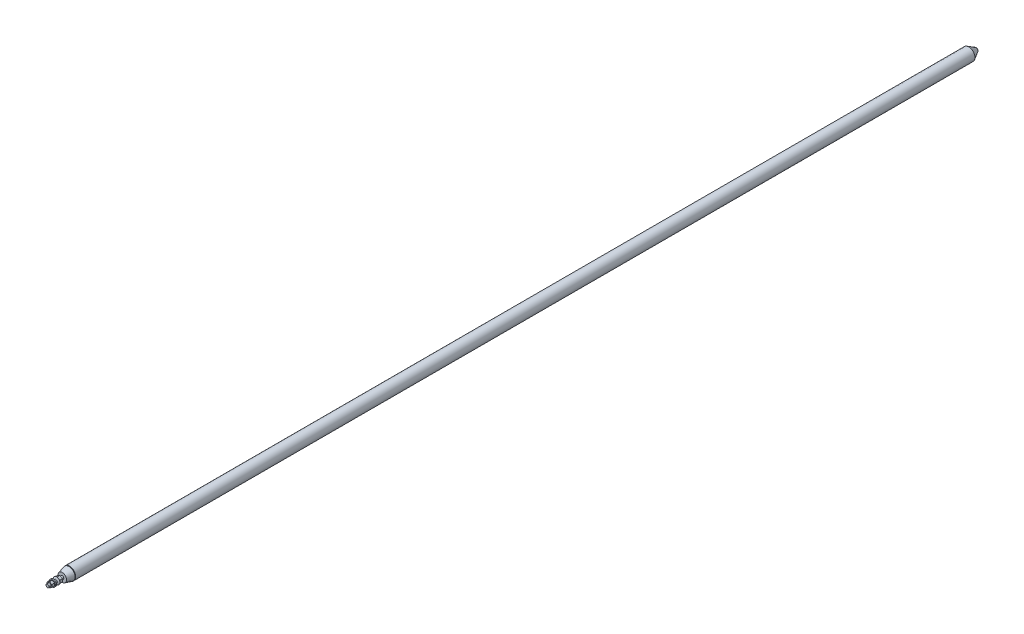
ISO-10303-21;
HEADER;
FILE_DESCRIPTION(('STEP AP214'),'2;1');
FILE_NAME('part.step','',(''),(''),'','','');
FILE_SCHEMA(('AUTOMOTIVE_DESIGN { 1 0 10303 214 1 1 1 1 }'));
ENDSEC;
DATA;
#1=APPLICATION_CONTEXT('core data for automotive mechanical design processes');
#2=APPLICATION_PROTOCOL_DEFINITION('international standard','automotive_design',2000,#1);
#3=PRODUCT_CONTEXT('',#1,'mechanical');
#4=PRODUCT('Part','Part','',(#3));
#5=PRODUCT_RELATED_PRODUCT_CATEGORY('part','',(#4));
#6=PRODUCT_DEFINITION_FORMATION('','',#4);
#7=PRODUCT_DEFINITION_CONTEXT('part definition',#1,'design');
#8=PRODUCT_DEFINITION('design','',#6,#7);
#9=PRODUCT_DEFINITION_SHAPE('','',#8);
#10=(LENGTH_UNIT() NAMED_UNIT(*) SI_UNIT(.MILLI.,.METRE.));
#11=(NAMED_UNIT(*) PLANE_ANGLE_UNIT() SI_UNIT($,.RADIAN.));
#12=(NAMED_UNIT(*) SI_UNIT($,.STERADIAN.) SOLID_ANGLE_UNIT());
#13=UNCERTAINTY_MEASURE_WITH_UNIT(LENGTH_MEASURE(1.E-05),#10,'distance_accuracy_value','');
#14=(GEOMETRIC_REPRESENTATION_CONTEXT(3) GLOBAL_UNCERTAINTY_ASSIGNED_CONTEXT((#13)) GLOBAL_UNIT_ASSIGNED_CONTEXT((#10,
#11,#12)) REPRESENTATION_CONTEXT('',''));
#15=CARTESIAN_POINT('',(0.,0.,0.));
#16=DIRECTION('',(0.,0.,1.));
#17=DIRECTION('',(1.,0.,0.));
#18=AXIS2_PLACEMENT_3D('',#15,#16,#17);
#19=CARTESIAN_POINT('',(0.,16.6751,52.1089983991226));
#20=DIRECTION('',(0.,0.,1.));
#21=DIRECTION('',(1.,0.,0.));
#22=AXIS2_PLACEMENT_3D('',#19,#20,#21);
#23=PLANE('',#22);
#24=CARTESIAN_POINT('',(0.,0.,52.1089983991226));
#25=DIRECTION('',(0.,0.,-1.));
#26=DIRECTION('',(-1.,0.,0.));
#27=AXIS2_PLACEMENT_3D('',#24,#25,#26);
#28=CIRCLE('',#27,16.6751);
#29=CARTESIAN_POINT('',(-16.6751,0.,52.1089983991226));
#30=VERTEX_POINT('',#29);
#31=EDGE_CURVE('E149',#30,#30,#28,.T.);
#32=ORIENTED_EDGE('',*,*,#31,.F.);
#33=EDGE_LOOP('',(#32));
#34=FACE_BOUND('',#33,.T.);
#35=DIRECTION('',(0.866025403784438,0.5,0.));
#36=VECTOR('',#35,1.);
#37=CARTESIAN_POINT('',(0.,-13.7554856334967,52.1089983991226));
#38=LINE('',#37,#36);
#39=CARTESIAN_POINT('',(0.,-13.7554856334967,52.1089983991226));
#40=VERTEX_POINT('',#39);
#41=CARTESIAN_POINT('',(11.9126,-6.87774281674833,52.1089983991226));
#42=VERTEX_POINT('',#41);
#43=EDGE_CURVE('E626',#40,#42,#38,.T.);
#44=ORIENTED_EDGE('',*,*,#43,.F.);
#45=DIRECTION('',(0.866025403784439,-0.499999999999999,0.));
#46=VECTOR('',#45,1.);
#47=CARTESIAN_POINT('',(-11.9126,-6.87774281674834,52.1089983991226));
#48=LINE('',#47,#46);
#49=CARTESIAN_POINT('',(-11.9126,-6.87774281674834,52.1089983991226));
#50=VERTEX_POINT('',#49);
#51=EDGE_CURVE('E147',#50,#40,#48,.T.);
#52=ORIENTED_EDGE('',*,*,#51,.F.);
#53=DIRECTION('',(0.,-1.,0.));
#54=VECTOR('',#53,1.);
#55=CARTESIAN_POINT('',(-11.9126,6.87774281674833,52.1089983991226));
#56=LINE('',#55,#54);
#57=CARTESIAN_POINT('',(-11.9126,6.87774281674833,52.1089983991226));
#58=VERTEX_POINT('',#57);
#59=EDGE_CURVE('E143',#58,#50,#56,.T.);
#60=ORIENTED_EDGE('',*,*,#59,.F.);
#61=DIRECTION('',(-0.866025403784439,-0.5,0.));
#62=VECTOR('',#61,1.);
#63=CARTESIAN_POINT('',(0.,13.7554856334967,52.1089983991226));
#64=LINE('',#63,#62);
#65=CARTESIAN_POINT('',(0.,13.7554856334967,52.1089983991226));
#66=VERTEX_POINT('',#65);
#67=EDGE_CURVE('E622',#66,#58,#64,.T.);
#68=ORIENTED_EDGE('',*,*,#67,.F.);
#69=DIRECTION('',(-0.866025403784439,0.5,0.));
#70=VECTOR('',#69,1.);
#71=CARTESIAN_POINT('',(11.9126,6.87774281674833,52.1089983991226));
#72=LINE('',#71,#70);
#73=CARTESIAN_POINT('',(11.9126,6.87774281674833,52.1089983991226));
#74=VERTEX_POINT('',#73);
#75=EDGE_CURVE('E634',#74,#66,#72,.T.);
#76=ORIENTED_EDGE('',*,*,#75,.F.);
#77=DIRECTION('',(0.,1.,0.));
#78=VECTOR('',#77,1.);
#79=CARTESIAN_POINT('',(11.9126,-6.87774281674833,52.1089983991226));
#80=LINE('',#79,#78);
#81=EDGE_CURVE('E628',#42,#74,#80,.T.);
#82=ORIENTED_EDGE('',*,*,#81,.F.);
#83=EDGE_LOOP('',(#44,#52,#60,#68,#76,#82));
#84=FACE_BOUND('',#83,.T.);
#85=ADVANCED_FACE('F33',(#34,#84),#23,.T.);
#86=CARTESIAN_POINT('',(0.,0.,0.));
#87=DIRECTION('',(0.,0.,-1.));
#88=DIRECTION('',(-1.,0.,0.));
#89=AXIS2_PLACEMENT_3D('',#86,#87,#88);
#90=CYLINDRICAL_SURFACE('',#89,7.93749999999999);
#91=CARTESIAN_POINT('',(0.,0.,46.2923983991226));
#92=DIRECTION('',(0.,0.,-1.));
#93=DIRECTION('',(-1.,0.,0.));
#94=AXIS2_PLACEMENT_3D('',#91,#92,#93);
#95=CIRCLE('',#94,7.93749999999999);
#96=CARTESIAN_POINT('',(-7.93749999999999,0.,46.2923983991226));
#97=VERTEX_POINT('',#96);
#98=EDGE_CURVE('E42',#97,#97,#95,.F.);
#99=ORIENTED_EDGE('',*,*,#98,.F.);
#100=EDGE_LOOP('',(#99));
#101=FACE_BOUND('',#100,.T.);
#102=CARTESIAN_POINT('',(0.,0.,33.5923983991226));
#103=DIRECTION('',(0.,0.,-1.));
#104=DIRECTION('',(-1.,0.,0.));
#105=AXIS2_PLACEMENT_3D('',#102,#103,#104);
#106=CIRCLE('',#105,7.93749999999999);
#107=CARTESIAN_POINT('',(0.,7.93749999999996,33.5923983991227));
#108=VERTEX_POINT('',#107);
#109=EDGE_CURVE('E236',#108,#108,#106,.T.);
#110=ORIENTED_EDGE('',*,*,#109,.F.);
#111=EDGE_LOOP('',(#110));
#112=FACE_BOUND('',#111,.T.);
#113=ADVANCED_FACE('F248',(#101,#112),#90,.T.);
#114=CARTESIAN_POINT('',(0.,0.,0.));
#115=DIRECTION('',(0.,0.,-1.));
#116=DIRECTION('',(-1.,0.,0.));
#117=AXIS2_PLACEMENT_3D('',#114,#115,#116);
#118=CIRCLE('',#117,7.93749999999999);
#119=CARTESIAN_POINT('',(-7.93749999999999,0.,0.));
#120=VERTEX_POINT('',#119);
#121=EDGE_CURVE('E224',#120,#120,#118,.T.);
#122=ORIENTED_EDGE('',*,*,#121,.F.);
#123=EDGE_LOOP('',(#122));
#124=FACE_BOUND('',#123,.T.);
#125=CARTESIAN_POINT('',(0.,0.,12.690475));
#126=DIRECTION('',(0.,0.,1.));
#127=DIRECTION('',(1.,0.,0.));
#128=AXIS2_PLACEMENT_3D('',#125,#126,#127);
#129=CIRCLE('',#128,7.93749999999999);
#130=CARTESIAN_POINT('',(7.93749999999999,0.,12.690475));
#131=VERTEX_POINT('',#130);
#132=EDGE_CURVE('E201',#131,#131,#129,.F.);
#133=ORIENTED_EDGE('',*,*,#132,.T.);
#134=EDGE_LOOP('',(#133));
#135=FACE_BOUND('',#134,.T.);
#136=ADVANCED_FACE('F251',(#124,#135),#90,.T.);
#137=CARTESIAN_POINT('',(0.,0.,-38.1));
#138=DIRECTION('',(0.,0.,1.));
#139=DIRECTION('',(1.,0.,0.));
#140=AXIS2_PLACEMENT_3D('',#137,#138,#139);
#141=CONICAL_SURFACE('',#140,28.575,0.780728808749583);
#142=CARTESIAN_POINT('',(0.,0.,-34.8952102827305));
#143=DIRECTION('',(0.,0.,-1.));
#144=DIRECTION('',(-1.,0.,0.));
#145=AXIS2_PLACEMENT_3D('',#142,#143,#144);
#146=CIRCLE('',#145,31.75);
#147=CARTESIAN_POINT('',(-31.75,0.,-34.8952102827305));
#148=VERTEX_POINT('',#147);
#149=EDGE_CURVE('E230',#148,#148,#146,.T.);
#150=ORIENTED_EDGE('',*,*,#149,.T.);
#151=EDGE_LOOP('',(#150));
#152=FACE_BOUND('',#151,.T.);
#153=CARTESIAN_POINT('',(0.,0.,-38.1));
#154=DIRECTION('',(0.,0.,-1.));
#155=DIRECTION('',(-1.,0.,0.));
#156=AXIS2_PLACEMENT_3D('',#153,#154,#155);
#157=CIRCLE('',#156,28.575);
#158=CARTESIAN_POINT('',(-28.575,0.,-38.1));
#159=VERTEX_POINT('',#158);
#160=EDGE_CURVE('E233',#159,#159,#157,.T.);
#161=ORIENTED_EDGE('',*,*,#160,.F.);
#162=EDGE_LOOP('',(#161));
#163=FACE_BOUND('',#162,.T.);
#164=ADVANCED_FACE('F454',(#152,#163),#141,.T.);
#165=CARTESIAN_POINT('',(0.,0.,-34.8952102827305));
#166=DIRECTION('',(0.,0.,-1.));
#167=DIRECTION('',(-1.,0.,0.));
#168=AXIS2_PLACEMENT_3D('',#165,#166,#167);
#169=CONICAL_SURFACE('',#168,31.75,0.266468742447018);
#170=CARTESIAN_POINT('',(0.,0.,0.));
#171=DIRECTION('',(0.,0.,-1.));
#172=DIRECTION('',(-1.,0.,0.));
#173=AXIS2_PLACEMENT_3D('',#170,#171,#172);
#174=CIRCLE('',#173,22.225);
#175=CARTESIAN_POINT('',(-22.225,0.,0.));
#176=VERTEX_POINT('',#175);
#177=EDGE_CURVE('E227',#176,#176,#174,.T.);
#178=ORIENTED_EDGE('',*,*,#177,.T.);
#179=EDGE_LOOP('',(#178));
#180=FACE_BOUND('',#179,.T.);
#181=ORIENTED_EDGE('',*,*,#149,.F.);
#182=EDGE_LOOP('',(#181));
#183=FACE_BOUND('',#182,.T.);
#184=ADVANCED_FACE('F540',(#180,#183),#169,.T.);
#185=CARTESIAN_POINT('',(0.,7.93749999999999,0.));
#186=DIRECTION('',(0.,0.,1.));
#187=DIRECTION('',(1.,0.,0.));
#188=AXIS2_PLACEMENT_3D('',#185,#186,#187);
#189=PLANE('',#188);
#190=ORIENTED_EDGE('',*,*,#121,.T.);
#191=EDGE_LOOP('',(#190));
#192=FACE_BOUND('',#191,.T.);
#193=ORIENTED_EDGE('',*,*,#177,.F.);
#194=EDGE_LOOP('',(#193));
#195=FACE_BOUND('',#194,.T.);
#196=ADVANCED_FACE('F527',(#192,#195),#189,.T.);
#197=CARTESIAN_POINT('',(0.,31.75,-38.1));
#198=DIRECTION('',(0.,0.,-1.));
#199=DIRECTION('',(-1.,0.,0.));
#200=AXIS2_PLACEMENT_3D('',#197,#198,#199);
#201=PLANE('',#200);
#202=ORIENTED_EDGE('',*,*,#160,.T.);
#203=EDGE_LOOP('',(#202));
#204=FACE_BOUND('',#203,.T.);
#205=CARTESIAN_POINT('',(0.,0.,-38.1));
#206=DIRECTION('',(0.,0.,1.));
#207=DIRECTION('',(1.,0.,0.));
#208=AXIS2_PLACEMENT_3D('',#205,#206,#207);
#209=CIRCLE('',#208,31.75);
#210=CARTESIAN_POINT('',(31.75,0.,-38.1));
#211=VERTEX_POINT('',#210);
#212=EDGE_CURVE('E205',#211,#211,#209,.T.);
#213=ORIENTED_EDGE('',*,*,#212,.T.);
#214=EDGE_LOOP('',(#213));
#215=FACE_BOUND('',#214,.T.);
#216=ADVANCED_FACE('F523',(#204,#215),#201,.F.);
#217=CARTESIAN_POINT('',(0.,0.,29.7434));
#218=DIRECTION('',(0.,0.,1.));
#219=DIRECTION('',(1.,0.,0.));
#220=AXIS2_PLACEMENT_3D('',#217,#218,#219);
#221=CYLINDRICAL_SURFACE('',#220,31.75);
#222=ORIENTED_EDGE('',*,*,#212,.F.);
#223=EDGE_LOOP('',(#222));
#224=FACE_BOUND('',#223,.T.);
#225=CARTESIAN_POINT('',(0.,0.,-4699.39623629016));
#226=DIRECTION('',(0.,0.,1.));
#227=DIRECTION('',(1.,0.,0.));
#228=AXIS2_PLACEMENT_3D('',#225,#226,#227);
#229=CIRCLE('',#228,31.75);
#230=CARTESIAN_POINT('',(31.75,0.,-4699.39623629016));
#231=VERTEX_POINT('',#230);
#232=EDGE_CURVE('E208',#231,#231,#229,.T.);
#233=ORIENTED_EDGE('',*,*,#232,.T.);
#234=EDGE_LOOP('',(#233));
#235=FACE_BOUND('',#234,.T.);
#236=ADVANCED_FACE('F526',(#224,#235),#221,.T.);
#237=CARTESIAN_POINT('',(0.,0.,-4735.33884943047));
#238=DIRECTION('',(0.,0.,1.));
#239=DIRECTION('',(1.,0.,0.));
#240=AXIS2_PLACEMENT_3D('',#237,#238,#239);
#241=CONICAL_SURFACE('',#240,10.9985226280628,0.523598775598275);
#242=ORIENTED_EDGE('',*,*,#232,.F.);
#243=EDGE_LOOP('',(#242));
#244=FACE_BOUND('',#243,.T.);
#245=CARTESIAN_POINT('',(0.,0.,-4735.33884943047));
#246=DIRECTION('',(0.,0.,1.));
#247=DIRECTION('',(1.,0.,0.));
#248=AXIS2_PLACEMENT_3D('',#245,#246,#247);
#249=CIRCLE('',#248,10.9985226280628);
#250=CARTESIAN_POINT('',(10.9985226280628,0.,-4735.33884943047));
#251=VERTEX_POINT('',#250);
#252=EDGE_CURVE('E211',#251,#251,#249,.T.);
#253=ORIENTED_EDGE('',*,*,#252,.T.);
#254=EDGE_LOOP('',(#253));
#255=FACE_BOUND('',#254,.T.);
#256=ADVANCED_FACE('F531',(#244,#255),#241,.T.);
#257=CARTESIAN_POINT('',(0.,0.,-4728.98884943047));
#258=DIRECTION('',(0.,0.,1.));
#259=DIRECTION('',(0.,1.,0.));
#260=AXIS2_PLACEMENT_3D('',#257,#258,#259);
#261=SPHERICAL_SURFACE('',#260,12.7000000000001);
#262=ORIENTED_EDGE('',*,*,#252,.F.);
#263=EDGE_LOOP('',(#262));
#264=FACE_BOUND('',#263,.T.);
#265=ADVANCED_FACE('F464',(#264),#261,.T.);
#266=CARTESIAN_POINT('',(13.5001,-7.79428636908687,12.690475));
#267=DIRECTION('',(-0.499999999999999,0.866025403784439,0.));
#268=DIRECTION('',(-0.866025403784439,-0.5,0.));
#269=AXIS2_PLACEMENT_3D('',#266,#267,#268);
#270=PLANE('',#269);
#271=DIRECTION('',(-0.866025403784439,-0.499999999999999,0.));
#272=VECTOR('',#271,1.);
#273=CARTESIAN_POINT('',(13.5001,-7.79428636908687,28.1686));
#274=LINE('',#273,#272);
#275=CARTESIAN_POINT('',(13.5001,-7.79428636908687,28.1686));
#276=VERTEX_POINT('',#275);
#277=CARTESIAN_POINT('',(0.,-15.5885727381737,28.1686));
#278=VERTEX_POINT('',#277);
#279=EDGE_CURVE('E160',#276,#278,#274,.T.);
#280=ORIENTED_EDGE('',*,*,#279,.T.);
#281=DIRECTION('',(0.,0.,1.));
#282=VECTOR('',#281,1.);
#283=CARTESIAN_POINT('',(0.,-15.5885727381737,12.690475));
#284=LINE('',#283,#282);
#285=CARTESIAN_POINT('',(0.,-15.5885727381737,12.690475));
#286=VERTEX_POINT('',#285);
#287=EDGE_CURVE('E199',#286,#278,#284,.T.);
#288=ORIENTED_EDGE('',*,*,#287,.F.);
#289=DIRECTION('',(-0.866025403784439,-0.499999999999999,0.));
#290=VECTOR('',#289,1.);
#291=CARTESIAN_POINT('',(13.5001,-7.79428636908687,12.690475));
#292=LINE('',#291,#290);
#293=CARTESIAN_POINT('',(13.5001,-7.79428636908687,12.690475));
#294=VERTEX_POINT('',#293);
#295=EDGE_CURVE('E161',#294,#286,#292,.T.);
#296=ORIENTED_EDGE('',*,*,#295,.F.);
#297=DIRECTION('',(0.,0.,1.));
#298=VECTOR('',#297,1.);
#299=CARTESIAN_POINT('',(13.5001,-7.79428636908687,12.690475));
#300=LINE('',#299,#298);
#301=EDGE_CURVE('E175',#294,#276,#300,.T.);
#302=ORIENTED_EDGE('',*,*,#301,.T.);
#303=EDGE_LOOP('',(#280,#288,#296,#302));
#304=FACE_BOUND('',#303,.T.);
#305=ADVANCED_FACE('F292',(#304),#270,.F.);
#306=CARTESIAN_POINT('',(0.,-15.5885727381737,12.690475));
#307=DIRECTION('',(0.5,0.866025403784438,0.));
#308=DIRECTION('',(-0.866025403784438,0.5,0.));
#309=AXIS2_PLACEMENT_3D('',#306,#307,#308);
#310=PLANE('',#309);
#311=DIRECTION('',(-0.866025403784438,0.5,0.));
#312=VECTOR('',#311,1.);
#313=CARTESIAN_POINT('',(0.,-15.5885727381737,28.1686));
#314=LINE('',#313,#312);
#315=CARTESIAN_POINT('',(-13.5001,-7.79428636908686,28.1686));
#316=VERTEX_POINT('',#315);
#317=EDGE_CURVE('E178',#278,#316,#314,.T.);
#318=ORIENTED_EDGE('',*,*,#317,.T.);
#319=DIRECTION('',(0.,0.,1.));
#320=VECTOR('',#319,1.);
#321=CARTESIAN_POINT('',(-13.5001,-7.79428636908686,12.690475));
#322=LINE('',#321,#320);
#323=CARTESIAN_POINT('',(-13.5001,-7.79428636908686,12.690475));
#324=VERTEX_POINT('',#323);
#325=EDGE_CURVE('E196',#324,#316,#322,.T.);
#326=ORIENTED_EDGE('',*,*,#325,.F.);
#327=DIRECTION('',(-0.866025403784438,0.5,0.));
#328=VECTOR('',#327,1.);
#329=CARTESIAN_POINT('',(0.,-15.5885727381737,12.690475));
#330=LINE('',#329,#328);
#331=EDGE_CURVE('E164',#286,#324,#330,.T.);
#332=ORIENTED_EDGE('',*,*,#331,.F.);
#333=ORIENTED_EDGE('',*,*,#287,.T.);
#334=EDGE_LOOP('',(#318,#326,#332,#333));
#335=FACE_BOUND('',#334,.T.);
#336=ADVANCED_FACE('F280',(#335),#310,.F.);
#337=CARTESIAN_POINT('',(-13.5001,-7.79428636908686,12.690475));
#338=DIRECTION('',(1.,0.,0.));
#339=DIRECTION('',(0.,1.,0.));
#340=AXIS2_PLACEMENT_3D('',#337,#338,#339);
#341=PLANE('',#340);
#342=DIRECTION('',(0.,1.,0.));
#343=VECTOR('',#342,1.);
#344=CARTESIAN_POINT('',(-13.5001,-7.79428636908686,28.1686));
#345=LINE('',#344,#343);
#346=CARTESIAN_POINT('',(-13.5001,7.79428636908686,28.1686));
#347=VERTEX_POINT('',#346);
#348=EDGE_CURVE('E180',#316,#347,#345,.T.);
#349=ORIENTED_EDGE('',*,*,#348,.T.);
#350=DIRECTION('',(0.,0.,1.));
#351=VECTOR('',#350,1.);
#352=CARTESIAN_POINT('',(-13.5001,7.79428636908686,12.690475));
#353=LINE('',#352,#351);
#354=CARTESIAN_POINT('',(-13.5001,7.79428636908686,12.690475));
#355=VERTEX_POINT('',#354);
#356=EDGE_CURVE('E193',#355,#347,#353,.T.);
#357=ORIENTED_EDGE('',*,*,#356,.F.);
#358=DIRECTION('',(0.,1.,0.));
#359=VECTOR('',#358,1.);
#360=CARTESIAN_POINT('',(-13.5001,-7.79428636908686,12.690475));
#361=LINE('',#360,#359);
#362=EDGE_CURVE('E167',#324,#355,#361,.T.);
#363=ORIENTED_EDGE('',*,*,#362,.F.);
#364=ORIENTED_EDGE('',*,*,#325,.T.);
#365=EDGE_LOOP('',(#349,#357,#363,#364));
#366=FACE_BOUND('',#365,.T.);
#367=ADVANCED_FACE('F284',(#366),#341,.F.);
#368=CARTESIAN_POINT('',(-13.5001,7.79428636908686,12.690475));
#369=DIRECTION('',(0.5,-0.866025403784439,0.));
#370=DIRECTION('',(0.866025403784439,0.5,0.));
#371=AXIS2_PLACEMENT_3D('',#368,#369,#370);
#372=PLANE('',#371);
#373=DIRECTION('',(0.866025403784439,0.5,0.));
#374=VECTOR('',#373,1.);
#375=CARTESIAN_POINT('',(-13.5001,7.79428636908686,28.1686));
#376=LINE('',#375,#374);
#377=CARTESIAN_POINT('',(0.,15.5885727381737,28.1686));
#378=VERTEX_POINT('',#377);
#379=EDGE_CURVE('E182',#347,#378,#376,.T.);
#380=ORIENTED_EDGE('',*,*,#379,.T.);
#381=DIRECTION('',(0.,0.,1.));
#382=VECTOR('',#381,1.);
#383=CARTESIAN_POINT('',(0.,15.5885727381737,12.690475));
#384=LINE('',#383,#382);
#385=CARTESIAN_POINT('',(0.,15.5885727381737,12.690475));
#386=VERTEX_POINT('',#385);
#387=EDGE_CURVE('E190',#386,#378,#384,.T.);
#388=ORIENTED_EDGE('',*,*,#387,.F.);
#389=DIRECTION('',(0.866025403784439,0.5,0.));
#390=VECTOR('',#389,1.);
#391=CARTESIAN_POINT('',(-13.5001,7.79428636908686,12.690475));
#392=LINE('',#391,#390);
#393=EDGE_CURVE('E169',#355,#386,#392,.T.);
#394=ORIENTED_EDGE('',*,*,#393,.F.);
#395=ORIENTED_EDGE('',*,*,#356,.T.);
#396=EDGE_LOOP('',(#380,#388,#394,#395));
#397=FACE_BOUND('',#396,.T.);
#398=ADVANCED_FACE('F299',(#397),#372,.F.);
#399=CARTESIAN_POINT('',(0.,15.5885727381737,12.690475));
#400=DIRECTION('',(-0.5,-0.866025403784438,0.));
#401=DIRECTION('',(0.866025403784439,-0.5,0.));
#402=AXIS2_PLACEMENT_3D('',#399,#400,#401);
#403=PLANE('',#402);
#404=DIRECTION('',(0.866025403784438,-0.5,0.));
#405=VECTOR('',#404,1.);
#406=CARTESIAN_POINT('',(0.,15.5885727381737,28.1686));
#407=LINE('',#406,#405);
#408=CARTESIAN_POINT('',(13.5001,7.79428636908686,28.1686));
#409=VERTEX_POINT('',#408);
#410=EDGE_CURVE('E184',#378,#409,#407,.T.);
#411=ORIENTED_EDGE('',*,*,#410,.T.);
#412=DIRECTION('',(0.,0.,1.));
#413=VECTOR('',#412,1.);
#414=CARTESIAN_POINT('',(13.5001,7.79428636908686,12.690475));
#415=LINE('',#414,#413);
#416=CARTESIAN_POINT('',(13.5001,7.79428636908686,12.690475));
#417=VERTEX_POINT('',#416);
#418=EDGE_CURVE('E57',#417,#409,#415,.T.);
#419=ORIENTED_EDGE('',*,*,#418,.F.);
#420=DIRECTION('',(0.866025403784438,-0.5,0.));
#421=VECTOR('',#420,1.);
#422=CARTESIAN_POINT('',(0.,15.5885727381737,12.690475));
#423=LINE('',#422,#421);
#424=EDGE_CURVE('E171',#386,#417,#423,.T.);
#425=ORIENTED_EDGE('',*,*,#424,.F.);
#426=ORIENTED_EDGE('',*,*,#387,.T.);
#427=EDGE_LOOP('',(#411,#419,#425,#426));
#428=FACE_BOUND('',#427,.T.);
#429=ADVANCED_FACE('F296',(#428),#403,.F.);
#430=CARTESIAN_POINT('',(13.5001,7.79428636908686,12.690475));
#431=DIRECTION('',(-1.,0.,0.));
#432=DIRECTION('',(0.,0.,1.));
#433=AXIS2_PLACEMENT_3D('',#430,#431,#432);
#434=PLANE('',#433);
#435=DIRECTION('',(0.,-1.,0.));
#436=VECTOR('',#435,1.);
#437=CARTESIAN_POINT('',(13.5001,7.79428636908686,28.1686));
#438=LINE('',#437,#436);
#439=EDGE_CURVE('E165',#409,#276,#438,.T.);
#440=ORIENTED_EDGE('',*,*,#439,.T.);
#441=ORIENTED_EDGE('',*,*,#301,.F.);
#442=DIRECTION('',(0.,-1.,0.));
#443=VECTOR('',#442,1.);
#444=CARTESIAN_POINT('',(13.5001,7.79428636908686,12.690475));
#445=LINE('',#444,#443);
#446=EDGE_CURVE('E173',#417,#294,#445,.T.);
#447=ORIENTED_EDGE('',*,*,#446,.F.);
#448=ORIENTED_EDGE('',*,*,#418,.T.);
#449=EDGE_LOOP('',(#440,#441,#447,#448));
#450=FACE_BOUND('',#449,.T.);
#451=ADVANCED_FACE('F293',(#450),#434,.F.);
#452=CARTESIAN_POINT('',(13.5001,-7.79428636908687,12.690475));
#453=DIRECTION('',(0.,0.,1.));
#454=DIRECTION('',(1.,0.,0.));
#455=AXIS2_PLACEMENT_3D('',#452,#453,#454);
#456=PLANE('',#455);
#457=ORIENTED_EDGE('',*,*,#132,.F.);
#458=EDGE_LOOP('',(#457));
#459=FACE_BOUND('',#458,.T.);
#460=ORIENTED_EDGE('',*,*,#295,.T.);
#461=ORIENTED_EDGE('',*,*,#331,.T.);
#462=ORIENTED_EDGE('',*,*,#362,.T.);
#463=ORIENTED_EDGE('',*,*,#393,.T.);
#464=ORIENTED_EDGE('',*,*,#424,.T.);
#465=ORIENTED_EDGE('',*,*,#446,.T.);
#466=EDGE_LOOP('',(#460,#461,#462,#463,#464,#465));
#467=FACE_BOUND('',#466,.T.);
#468=ADVANCED_FACE('F260',(#459,#467),#456,.F.);
#469=CARTESIAN_POINT('',(0.,0.,0.0435161764705885));
#470=DIRECTION('',(0.,0.,-1.));
#471=DIRECTION('',(0.,1.,0.));
#472=AXIS2_PLACEMENT_3D('',#469,#470,#471);
#473=SPHERICAL_SURFACE('',#472,34.4750838235294);
#474=CARTESIAN_POINT('',(0.,0.,29.7688));
#475=DIRECTION('',(0.,0.,-1.));
#476=DIRECTION('',(-1.,0.,0.));
#477=AXIS2_PLACEMENT_3D('',#474,#475,#476);
#478=CIRCLE('',#477,17.4625);
#479=CARTESIAN_POINT('',(0.,17.4625,29.7688));
#480=VERTEX_POINT('',#479);
#481=EDGE_CURVE('E215',#480,#480,#478,.T.);
#482=CARTESIAN_POINT('',(0.,7.93749999999996,33.5923983991227));
#483=CARTESIAN_POINT('',(0.,8.04193033230631,33.5676907138939));
#484=CARTESIAN_POINT('',(0.,8.14624529277318,33.5424953955937));
#485=CARTESIAN_POINT('',(0.,8.35463538983752,33.4911317569022));
#486=CARTESIAN_POINT('',(0.,8.458710526435,33.464963436511));
#487=CARTESIAN_POINT('',(0.,8.66661189557016,33.4116560576896));
#488=CARTESIAN_POINT('',(0.,8.77043812810784,33.3845169992594));
#489=CARTESIAN_POINT('',(0.,8.97783263624223,33.3292705157999));
#490=CARTESIAN_POINT('',(0.,9.08140091183892,33.3011630907704));
#491=CARTESIAN_POINT('',(0.,9.28827047420351,33.2439823239056));
#492=CARTESIAN_POINT('',(0.,9.39157176097139,33.2149089820701));
#493=CARTESIAN_POINT('',(0.,9.59789833747534,33.1557989172506));
#494=CARTESIAN_POINT('',(0.,9.7009236272114,33.1257621942665));
#495=CARTESIAN_POINT('',(0.,9.90668922540895,33.0647279863804));
#496=CARTESIAN_POINT('',(0.,10.0094295338704,33.0337305014784));
#497=CARTESIAN_POINT('',(0.,10.2146162101565,32.9707774728867));
#498=CARTESIAN_POINT('',(0.,10.3170625779811,32.938821929197));
#499=CARTESIAN_POINT('',(0.,10.521652439256,32.8739555696753));
#500=CARTESIAN_POINT('',(0.,10.6237959327063,32.8410447538433));
#501=CARTESIAN_POINT('',(0.,10.8277711379095,32.7742707199945));
#502=CARTESIAN_POINT('',(0.,10.9296028496623,32.7404075019776));
#503=CARTESIAN_POINT('',(0.,11.132945611335,32.6717316167674));
#504=CARTESIAN_POINT('',(0.,11.234456661255,32.636918949574));
#505=CARTESIAN_POINT('',(0.,11.4371492470899,32.5663472018157));
#506=CARTESIAN_POINT('',(0.,11.5383307830049,32.5305881212508));
#507=CARTESIAN_POINT('',(0.,11.7403555173927,32.458126665085));
#508=CARTESIAN_POINT('',(0.,11.8411987158655,32.4214242894841));
#509=CARTESIAN_POINT('',(0.,12.042537981436,32.3470794438415));
#510=CARTESIAN_POINT('',(0.,12.1430340485337,32.3094369737997));
#511=CARTESIAN_POINT('',(0.,12.3436702876927,32.2332152218499));
#512=CARTESIAN_POINT('',(0.,12.4438104597538,32.194635939942));
#513=CARTESIAN_POINT('',(0.,12.6437261762134,32.1165439285288));
#514=CARTESIAN_POINT('',(0.,12.7435017206118,32.0770311990235));
#515=CARTESIAN_POINT('',(0.,12.9426794809169,31.9970757380846));
#516=CARTESIAN_POINT('',(0.,13.0420816968236,31.956633006651));
#517=CARTESIAN_POINT('',(0.,13.2405041318717,31.8748210686243));
#518=CARTESIAN_POINT('',(0.,13.3395243510132,31.8334518620313));
#519=CARTESIAN_POINT('',(0.,13.5371741575694,31.7497905812473));
#520=CARTESIAN_POINT('',(0.,13.6358037449841,31.7074985070563));
#521=CARTESIAN_POINT('',(0.,13.8326636871895,31.6219951791153));
#522=CARTESIAN_POINT('',(0.,13.9308940419803,31.5787839253653));
#523=CARTESIAN_POINT('',(0.,14.1269469528556,31.4914460065018));
#524=CARTESIAN_POINT('',(0.,14.2247695089402,31.4473193413882));
#525=CARTESIAN_POINT('',(0.,14.4199982918825,31.3581544478201));
#526=CARTESIAN_POINT('',(0.,14.5174045187402,31.3131162193657));
#527=CARTESIAN_POINT('',(0.,14.7117921490136,31.2221321266308));
#528=CARTESIAN_POINT('',(0.,14.8087735524293,31.1761862623503));
#529=CARTESIAN_POINT('',(0.,15.0023030786502,31.0833909046278));
#530=CARTESIAN_POINT('',(0.,15.0988512014553,31.0365414111859));
#531=CARTESIAN_POINT('',(0.,15.2915057470694,30.9419428806036));
#532=CARTESIAN_POINT('',(0.,15.3876121698782,30.8941938434631));
#533=CARTESIAN_POINT('',(0.,15.579374934636,30.7978003893978));
#534=CARTESIAN_POINT('',(0.,15.675031276585,30.749155972473));
#535=CARTESIAN_POINT('',(0.,15.8658855379922,30.6509760008058));
#536=CARTESIAN_POINT('',(0.,15.9610834574505,30.6014404460634));
#537=CARTESIAN_POINT('',(0.,16.1510125722821,30.5014825185434));
#538=CARTESIAN_POINT('',(0.,16.2457437676554,30.4510601457658));
#539=CARTESIAN_POINT('',(0.,16.4347311731984,30.3493329789012));
#540=CARTESIAN_POINT('',(0.,16.5289873833681,30.2980281848143));
#541=CARTESIAN_POINT('',(0.,16.7170165996438,30.194540650465));
#542=CARTESIAN_POINT('',(0.,16.8107896057498,30.1423579102026));
#543=CARTESIAN_POINT('',(0.,16.9978442340481,30.0371190297578));
#544=CARTESIAN_POINT('',(0.,17.0911258562404,29.9840628895754));
#545=CARTESIAN_POINT('',(0.,17.2771895913833,29.877081852009));
#546=CARTESIAN_POINT('',(0.,17.369971704334,29.8231569546252));
#547=CARTESIAN_POINT('',(0.,17.4625,29.7688));
#548=B_SPLINE_CURVE_WITH_KNOTS('',3,(#482,#483,#484,#485,#486,#487,#488,#489,#490,#491,#492,
#493,#494,#495,#496,#497,#498,#499,#500,#501,#502,#503,#504,#505,#506,#507,#508,#509,#510,#511,
#512,#513,#514,#515,#516,#517,#518,#519,#520,#521,#522,#523,#524,#525,#526,#527,#528,#529,#530,
#531,#532,#533,#534,#535,#536,#537,#538,#539,#540,#541,#542,#543,#544,#545,#546,#547),
.UNSPECIFIED.,.F.,.F.,(4,2,2,2,2,2,2,2,2,2,2,2,2,2,2,2,2,2,2,2,2,2,2,2,2,2,2,2,2,2,2,2,4),(0.,
0.321939004572816,0.643878009145632,0.965817013718447,1.28775601829126,1.60969502286408,
1.9316340274369,2.25357303200971,2.57551203658253,2.89745104115534,3.21939004572815,
3.54132905030097,3.86326805487378,4.1852070594466,4.50714606401941,4.82908506859223,
5.15102407316505,5.47296307773786,5.79490208231068,6.11684108688349,6.43878009145631,
6.76071909602913,7.08265810060194,7.40459710517475,7.72653610974757,8.04847511432038,
8.3704141188932,8.69235312346602,9.01429212803883,9.33623113261165,9.65817013718446,
9.98010914175728,10.3020481463301),.UNSPECIFIED.);
#549=EDGE_CURVE('BSEAM256',#108,#480,#548,.T.);
#550=ORIENTED_EDGE('',*,*,#109,.T.);
#551=ORIENTED_EDGE('',*,*,#481,.F.);
#552=ORIENTED_EDGE('',*,*,#549,.T.);
#553=ORIENTED_EDGE('',*,*,#549,.F.);
#554=EDGE_LOOP('',(#550,#552,#551,#553));
#555=FACE_BOUND('',#554,.T.);
#556=ADVANCED_FACE('F256',(#555),#473,.T.);
#557=CARTESIAN_POINT('',(0.,0.,0.));
#558=DIRECTION('',(0.,0.,-1.));
#559=DIRECTION('',(-1.,0.,0.));
#560=AXIS2_PLACEMENT_3D('',#557,#558,#559);
#561=CYLINDRICAL_SURFACE('',#560,17.4625);
#562=ORIENTED_EDGE('',*,*,#481,.T.);
#563=EDGE_LOOP('',(#562));
#564=FACE_BOUND('',#563,.T.);
#565=CARTESIAN_POINT('',(0.,0.,28.1686));
#566=DIRECTION('',(0.,0.,-1.));
#567=DIRECTION('',(-1.,0.,0.));
#568=AXIS2_PLACEMENT_3D('',#565,#566,#567);
#569=CIRCLE('',#568,17.4625);
#570=CARTESIAN_POINT('',(-17.4625,0.,28.1686));
#571=VERTEX_POINT('',#570);
#572=EDGE_CURVE('E218',#571,#571,#569,.T.);
#573=ORIENTED_EDGE('',*,*,#572,.F.);
#574=EDGE_LOOP('',(#573));
#575=FACE_BOUND('',#574,.T.);
#576=ADVANCED_FACE('F259',(#564,#575),#561,.T.);
#577=CARTESIAN_POINT('',(0.,0.,28.1686));
#578=DIRECTION('',(0.,0.,-1.));
#579=DIRECTION('',(-1.,0.,0.));
#580=AXIS2_PLACEMENT_3D('',#577,#578,#579);
#581=PLANE('',#580);
#582=ORIENTED_EDGE('',*,*,#572,.T.);
#583=EDGE_LOOP('',(#582));
#584=FACE_BOUND('',#583,.T.);
#585=ORIENTED_EDGE('',*,*,#317,.F.);
#586=ORIENTED_EDGE('',*,*,#279,.F.);
#587=ORIENTED_EDGE('',*,*,#439,.F.);
#588=ORIENTED_EDGE('',*,*,#410,.F.);
#589=ORIENTED_EDGE('',*,*,#379,.F.);
#590=ORIENTED_EDGE('',*,*,#348,.F.);
#591=EDGE_LOOP('',(#585,#586,#587,#588,#589,#590));
#592=FACE_BOUND('',#591,.T.);
#593=ADVANCED_FACE('F266',(#584,#592),#581,.T.);
#594=CARTESIAN_POINT('',(0.,0.,46.2923983991226));
#595=DIRECTION('',(0.,0.,-1.));
#596=DIRECTION('',(-1.,0.,0.));
#597=AXIS2_PLACEMENT_3D('',#594,#595,#596);
#598=PLANE('',#597);
#599=ORIENTED_EDGE('',*,*,#98,.T.);
#600=EDGE_LOOP('',(#599));
#601=FACE_BOUND('',#600,.T.);
#602=CARTESIAN_POINT('',(0.,0.,46.2923983991226));
#603=DIRECTION('',(0.,0.,-1.));
#604=DIRECTION('',(-1.,0.,0.));
#605=AXIS2_PLACEMENT_3D('',#602,#603,#604);
#606=CIRCLE('',#605,16.6751);
#607=CARTESIAN_POINT('',(-16.6751,0.,46.2923983991226));
#608=VERTEX_POINT('',#607);
#609=EDGE_CURVE('E152',#608,#608,#606,.T.);
#610=ORIENTED_EDGE('',*,*,#609,.T.);
#611=EDGE_LOOP('',(#610));
#612=FACE_BOUND('',#611,.T.);
#613=ADVANCED_FACE('F245',(#601,#612),#598,.T.);
#614=CARTESIAN_POINT('',(0.,0.,0.));
#615=DIRECTION('',(0.,0.,-1.));
#616=DIRECTION('',(-1.,0.,0.));
#617=AXIS2_PLACEMENT_3D('',#614,#615,#616);
#618=CYLINDRICAL_SURFACE('',#617,16.6751);
#619=ORIENTED_EDGE('',*,*,#31,.T.);
#620=EDGE_LOOP('',(#619));
#621=FACE_BOUND('',#620,.T.);
#622=ORIENTED_EDGE('',*,*,#609,.F.);
#623=EDGE_LOOP('',(#622));
#624=FACE_BOUND('',#623,.T.);
#625=ADVANCED_FACE('F318',(#621,#624),#618,.T.);
#626=CARTESIAN_POINT('',(-11.9126,-6.87774281674834,65.9996233991226));
#627=DIRECTION('',(0.499999999999999,0.866025403784439,0.));
#628=DIRECTION('',(-0.866025403784439,0.499999999999999,0.));
#629=AXIS2_PLACEMENT_3D('',#626,#627,#628);
#630=PLANE('',#629);
#631=ORIENTED_EDGE('',*,*,#51,.T.);
#632=DIRECTION('',(0.,0.,-1.));
#633=VECTOR('',#632,1.);
#634=CARTESIAN_POINT('',(0.,-13.7554856334967,65.9996233991226));
#635=LINE('',#634,#633);
#636=CARTESIAN_POINT('',(0.,-13.7554856334967,65.9996233991226));
#637=VERTEX_POINT('',#636);
#638=EDGE_CURVE('E128',#637,#40,#635,.T.);
#639=ORIENTED_EDGE('',*,*,#638,.F.);
#640=DIRECTION('',(0.866025403784439,-0.499999999999999,0.));
#641=VECTOR('',#640,1.);
#642=CARTESIAN_POINT('',(-11.9126,-6.87774281674834,65.9996233991226));
#643=LINE('',#642,#641);
#644=CARTESIAN_POINT('',(-11.9126,-6.87774281674834,65.9996233991226));
#645=VERTEX_POINT('',#644);
#646=EDGE_CURVE('E135',#645,#637,#643,.T.);
#647=ORIENTED_EDGE('',*,*,#646,.F.);
#648=DIRECTION('',(0.,0.,-1.));
#649=VECTOR('',#648,1.);
#650=CARTESIAN_POINT('',(-11.9126,-6.87774281674834,65.9996233991226));
#651=LINE('',#650,#649);
#652=EDGE_CURVE('E620',#645,#50,#651,.T.);
#653=ORIENTED_EDGE('',*,*,#652,.T.);
#654=EDGE_LOOP('',(#631,#639,#647,#653));
#655=FACE_BOUND('',#654,.T.);
#656=ADVANCED_FACE('F145',(#655),#630,.F.);
#657=CARTESIAN_POINT('',(0.,-13.7554856334967,65.9996233991226));
#658=DIRECTION('',(-0.5,0.866025403784438,0.));
#659=DIRECTION('',(-0.866025403784438,-0.5,0.));
#660=AXIS2_PLACEMENT_3D('',#657,#658,#659);
#661=PLANE('',#660);
#662=ORIENTED_EDGE('',*,*,#43,.T.);
#663=DIRECTION('',(0.,0.,-1.));
#664=VECTOR('',#663,1.);
#665=CARTESIAN_POINT('',(11.9126,-6.87774281674833,65.9996233991226));
#666=LINE('',#665,#664);
#667=CARTESIAN_POINT('',(11.9126,-6.87774281674833,65.9996233991226));
#668=VERTEX_POINT('',#667);
#669=EDGE_CURVE('E131',#668,#42,#666,.T.);
#670=ORIENTED_EDGE('',*,*,#669,.F.);
#671=DIRECTION('',(0.866025403784438,0.5,0.));
#672=VECTOR('',#671,1.);
#673=CARTESIAN_POINT('',(0.,-13.7554856334967,65.9996233991226));
#674=LINE('',#673,#672);
#675=EDGE_CURVE('E124',#637,#668,#674,.T.);
#676=ORIENTED_EDGE('',*,*,#675,.F.);
#677=ORIENTED_EDGE('',*,*,#638,.T.);
#678=EDGE_LOOP('',(#662,#670,#676,#677));
#679=FACE_BOUND('',#678,.T.);
#680=ADVANCED_FACE('F126',(#679),#661,.F.);
#681=CARTESIAN_POINT('',(11.9126,-6.87774281674833,65.9996233991226));
#682=DIRECTION('',(-1.,0.,0.));
#683=DIRECTION('',(0.,-1.,0.));
#684=AXIS2_PLACEMENT_3D('',#681,#682,#683);
#685=PLANE('',#684);
#686=ORIENTED_EDGE('',*,*,#81,.T.);
#687=DIRECTION('',(0.,0.,-1.));
#688=VECTOR('',#687,1.);
#689=CARTESIAN_POINT('',(11.9126,6.87774281674833,65.9996233991226));
#690=LINE('',#689,#688);
#691=CARTESIAN_POINT('',(11.9126,6.87774281674833,65.9996233991226));
#692=VERTEX_POINT('',#691);
#693=EDGE_CURVE('E154',#692,#74,#690,.T.);
#694=ORIENTED_EDGE('',*,*,#693,.F.);
#695=DIRECTION('',(0.,1.,0.));
#696=VECTOR('',#695,1.);
#697=CARTESIAN_POINT('',(11.9126,-6.87774281674833,65.9996233991226));
#698=LINE('',#697,#696);
#699=EDGE_CURVE('E134',#668,#692,#698,.T.);
#700=ORIENTED_EDGE('',*,*,#699,.F.);
#701=ORIENTED_EDGE('',*,*,#669,.T.);
#702=EDGE_LOOP('',(#686,#694,#700,#701));
#703=FACE_BOUND('',#702,.T.);
#704=ADVANCED_FACE('F370',(#703),#685,.F.);
#705=CARTESIAN_POINT('',(11.9126,6.87774281674833,65.9996233991226));
#706=DIRECTION('',(-0.5,-0.866025403784439,0.));
#707=DIRECTION('',(0.866025403784439,-0.5,0.));
#708=AXIS2_PLACEMENT_3D('',#705,#706,#707);
#709=PLANE('',#708);
#710=ORIENTED_EDGE('',*,*,#75,.T.);
#711=DIRECTION('',(0.,0.,-1.));
#712=VECTOR('',#711,1.);
#713=CARTESIAN_POINT('',(0.,13.7554856334967,65.9996233991226));
#714=LINE('',#713,#712);
#715=CARTESIAN_POINT('',(0.,13.7554856334967,65.9996233991226));
#716=VERTEX_POINT('',#715);
#717=EDGE_CURVE('E638',#716,#66,#714,.T.);
#718=ORIENTED_EDGE('',*,*,#717,.F.);
#719=DIRECTION('',(-0.866025403784439,0.5,0.));
#720=VECTOR('',#719,1.);
#721=CARTESIAN_POINT('',(11.9126,6.87774281674833,65.9996233991226));
#722=LINE('',#721,#720);
#723=EDGE_CURVE('E645',#692,#716,#722,.T.);
#724=ORIENTED_EDGE('',*,*,#723,.F.);
#725=ORIENTED_EDGE('',*,*,#693,.T.);
#726=EDGE_LOOP('',(#710,#718,#724,#725));
#727=FACE_BOUND('',#726,.T.);
#728=ADVANCED_FACE('F376',(#727),#709,.F.);
#729=CARTESIAN_POINT('',(0.,13.7554856334967,65.9996233991226));
#730=DIRECTION('',(0.5,-0.866025403784439,0.));
#731=DIRECTION('',(0.866025403784439,0.5,0.));
#732=AXIS2_PLACEMENT_3D('',#729,#730,#731);
#733=PLANE('',#732);
#734=ORIENTED_EDGE('',*,*,#67,.T.);
#735=DIRECTION('',(0.,0.,-1.));
#736=VECTOR('',#735,1.);
#737=CARTESIAN_POINT('',(-11.9126,6.87774281674833,65.9996233991226));
#738=LINE('',#737,#736);
#739=CARTESIAN_POINT('',(-11.9126,6.87774281674833,65.9996233991226));
#740=VERTEX_POINT('',#739);
#741=EDGE_CURVE('E49',#740,#58,#738,.T.);
#742=ORIENTED_EDGE('',*,*,#741,.F.);
#743=DIRECTION('',(-0.866025403784439,-0.5,0.));
#744=VECTOR('',#743,1.);
#745=CARTESIAN_POINT('',(0.,13.7554856334967,65.9996233991226));
#746=LINE('',#745,#744);
#747=EDGE_CURVE('E647',#716,#740,#746,.T.);
#748=ORIENTED_EDGE('',*,*,#747,.F.);
#749=ORIENTED_EDGE('',*,*,#717,.T.);
#750=EDGE_LOOP('',(#734,#742,#748,#749));
#751=FACE_BOUND('',#750,.T.);
#752=ADVANCED_FACE('F384',(#751),#733,.F.);
#753=CARTESIAN_POINT('',(-11.9126,6.87774281674833,65.9996233991226));
#754=DIRECTION('',(1.,0.,0.));
#755=DIRECTION('',(0.,1.,0.));
#756=AXIS2_PLACEMENT_3D('',#753,#754,#755);
#757=PLANE('',#756);
#758=ORIENTED_EDGE('',*,*,#59,.T.);
#759=ORIENTED_EDGE('',*,*,#652,.F.);
#760=DIRECTION('',(0.,-1.,0.));
#761=VECTOR('',#760,1.);
#762=CARTESIAN_POINT('',(-11.9126,6.87774281674833,65.9996233991226));
#763=LINE('',#762,#761);
#764=EDGE_CURVE('E139',#740,#645,#763,.T.);
#765=ORIENTED_EDGE('',*,*,#764,.F.);
#766=ORIENTED_EDGE('',*,*,#741,.T.);
#767=EDGE_LOOP('',(#758,#759,#765,#766));
#768=FACE_BOUND('',#767,.T.);
#769=ADVANCED_FACE('F392',(#768),#757,.F.);
#770=CARTESIAN_POINT('',(11.9126,-20.633228450245,65.9996233991226));
#771=DIRECTION('',(0.,0.,1.));
#772=DIRECTION('',(1.,0.,0.));
#773=AXIS2_PLACEMENT_3D('',#770,#771,#772);
#774=PLANE('',#773);
#775=CARTESIAN_POINT('',(0.,0.,65.9996233991226));
#776=DIRECTION('',(0.,0.,1.));
#777=DIRECTION('',(1.,0.,0.));
#778=AXIS2_PLACEMENT_3D('',#775,#776,#777);
#779=CIRCLE('',#778,7.93749999999999);
#780=CARTESIAN_POINT('',(7.93749999999999,0.,65.9996233991226));
#781=VERTEX_POINT('',#780);
#782=EDGE_CURVE('E11',#781,#781,#779,.F.);
#783=ORIENTED_EDGE('',*,*,#782,.T.);
#784=EDGE_LOOP('',(#783));
#785=FACE_BOUND('',#784,.T.);
#786=ORIENTED_EDGE('',*,*,#646,.T.);
#787=ORIENTED_EDGE('',*,*,#675,.T.);
#788=ORIENTED_EDGE('',*,*,#699,.T.);
#789=ORIENTED_EDGE('',*,*,#723,.T.);
#790=ORIENTED_EDGE('',*,*,#747,.T.);
#791=ORIENTED_EDGE('',*,*,#764,.T.);
#792=EDGE_LOOP('',(#786,#787,#788,#789,#790,#791));
#793=FACE_BOUND('',#792,.T.);
#794=ADVANCED_FACE('F138',(#785,#793),#774,.T.);
#795=CARTESIAN_POINT('',(0.,0.,76.2));
#796=DIRECTION('',(0.,0.,1.));
#797=DIRECTION('',(1.,0.,0.));
#798=AXIS2_PLACEMENT_3D('',#795,#796,#797);
#799=PLANE('',#798);
#800=CARTESIAN_POINT('',(0.,0.,76.2));
#801=DIRECTION('',(0.,0.,-1.));
#802=DIRECTION('',(-1.,0.,0.));
#803=AXIS2_PLACEMENT_3D('',#800,#801,#802);
#804=CIRCLE('',#803,7.93749999999999);
#805=CARTESIAN_POINT('',(-7.93749999999999,0.,76.2));
#806=VERTEX_POINT('',#805);
#807=EDGE_CURVE('E221',#806,#806,#804,.T.);
#808=ORIENTED_EDGE('',*,*,#807,.F.);
#809=EDGE_LOOP('',(#808));
#810=FACE_BOUND('',#809,.T.);
#811=ADVANCED_FACE('F406',(#810),#799,.T.);
#812=ORIENTED_EDGE('',*,*,#782,.F.);
#813=EDGE_LOOP('',(#812));
#814=FACE_BOUND('',#813,.T.);
#815=ORIENTED_EDGE('',*,*,#807,.T.);
#816=EDGE_LOOP('',(#815));
#817=FACE_BOUND('',#816,.T.);
#818=ADVANCED_FACE('F253',(#814,#817),#90,.T.);
#819=CLOSED_SHELL('',(#85,#113,#136,#164,#184,#196,#216,#236,#256,#265,#305,#336,#367,#398,#429,
#451,#468,#556,#576,#593,#613,#625,#656,#680,#704,#728,#752,#769,#794,#811,#818));
#820=CARTESIAN_POINT('',(0.,28.575,-47.625));
#821=DIRECTION('',(0.,0.,-1.));
#822=DIRECTION('',(-1.,0.,0.));
#823=AXIS2_PLACEMENT_3D('',#820,#821,#822);
#824=PLANE('',#823);
#825=CARTESIAN_POINT('',(0.,0.,-47.625));
#826=DIRECTION('',(0.,0.,-1.));
#827=DIRECTION('',(-1.,0.,0.));
#828=AXIS2_PLACEMENT_3D('',#825,#826,#827);
#829=CIRCLE('',#828,28.5623);
#830=CARTESIAN_POINT('',(-28.5623,0.,-47.625));
#831=VERTEX_POINT('',#830);
#832=EDGE_CURVE('E214',#831,#831,#829,.T.);
#833=ORIENTED_EDGE('',*,*,#832,.T.);
#834=EDGE_LOOP('',(#833));
#835=FACE_BOUND('',#834,.T.);
#836=ADVANCED_FACE('F35',(#835),#824,.T.);
#837=CARTESIAN_POINT('',(0.,0.,29.7434));
#838=DIRECTION('',(0.,0.,1.));
#839=DIRECTION('',(1.,0.,0.));
#840=AXIS2_PLACEMENT_3D('',#837,#838,#839);
#841=CYLINDRICAL_SURFACE('',#840,28.5623);
#842=ORIENTED_EDGE('',*,*,#832,.F.);
#843=EDGE_LOOP('',(#842));
#844=FACE_BOUND('',#843,.T.);
#845=CARTESIAN_POINT('',(0.,0.,-4699.39623629016));
#846=DIRECTION('',(0.,0.,1.));
#847=DIRECTION('',(1.,0.,0.));
#848=AXIS2_PLACEMENT_3D('',#845,#846,#847);
#849=CIRCLE('',#848,28.5623);
#850=CARTESIAN_POINT('',(28.5623,0.,-4699.39623629016));
#851=VERTEX_POINT('',#850);
#852=EDGE_CURVE('E202',#851,#851,#849,.T.);
#853=ORIENTED_EDGE('',*,*,#852,.F.);
#854=EDGE_LOOP('',(#853));
#855=FACE_BOUND('',#854,.T.);
#856=ADVANCED_FACE('F427',(#844,#855),#841,.F.);
#857=CARTESIAN_POINT('',(0.,28.5623,-4699.39623629016));
#858=DIRECTION('',(0.,0.,-1.));
#859=DIRECTION('',(-1.,0.,0.));
#860=AXIS2_PLACEMENT_3D('',#857,#858,#859);
#861=PLANE('',#860);
#862=ORIENTED_EDGE('',*,*,#852,.T.);
#863=EDGE_LOOP('',(#862));
#864=FACE_BOUND('',#863,.T.);
#865=ADVANCED_FACE('F436',(#864),#861,.F.);
#866=CLOSED_SHELL('',(#836,#856,#865));
#867=ORIENTED_CLOSED_SHELL('',*,#866,.T.);
#868=BREP_WITH_VOIDS('B2',#819,(#867));
#869=ADVANCED_BREP_SHAPE_REPRESENTATION('',(#18,#868),#14);
#870=SHAPE_DEFINITION_REPRESENTATION(#9,#869);
ENDSEC;
END-ISO-10303-21;
